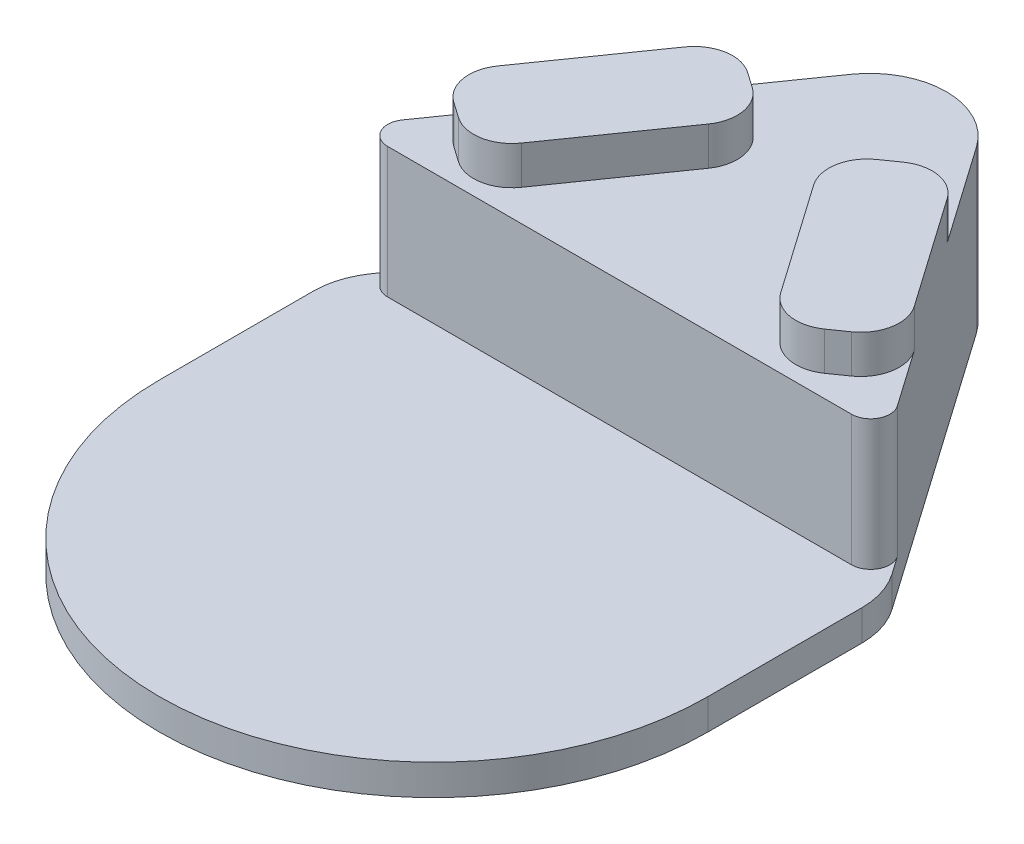
ISO-10303-21;
HEADER;
FILE_DESCRIPTION(('STEP AP214'),'2;1');
FILE_NAME('part.step','',(''),(''),'','','');
FILE_SCHEMA(('AUTOMOTIVE_DESIGN { 1 0 10303 214 1 1 1 1 }'));
ENDSEC;
DATA;
#1=APPLICATION_CONTEXT('core data for automotive mechanical design processes');
#2=APPLICATION_PROTOCOL_DEFINITION('international standard','automotive_design',2000,#1);
#3=PRODUCT_CONTEXT('',#1,'mechanical');
#4=PRODUCT('Part','Part','',(#3));
#5=PRODUCT_RELATED_PRODUCT_CATEGORY('part','',(#4));
#6=PRODUCT_DEFINITION_FORMATION('','',#4);
#7=PRODUCT_DEFINITION_CONTEXT('part definition',#1,'design');
#8=PRODUCT_DEFINITION('design','',#6,#7);
#9=PRODUCT_DEFINITION_SHAPE('','',#8);
#10=(LENGTH_UNIT() NAMED_UNIT(*) SI_UNIT(.MILLI.,.METRE.));
#11=(NAMED_UNIT(*) PLANE_ANGLE_UNIT() SI_UNIT($,.RADIAN.));
#12=(NAMED_UNIT(*) SI_UNIT($,.STERADIAN.) SOLID_ANGLE_UNIT());
#13=UNCERTAINTY_MEASURE_WITH_UNIT(LENGTH_MEASURE(1.E-05),#10,'distance_accuracy_value','');
#14=(GEOMETRIC_REPRESENTATION_CONTEXT(3) GLOBAL_UNCERTAINTY_ASSIGNED_CONTEXT((#13)) GLOBAL_UNIT_ASSIGNED_CONTEXT((#10,
#11,#12)) REPRESENTATION_CONTEXT('',''));
#15=CARTESIAN_POINT('',(0.,0.,0.));
#16=DIRECTION('',(0.,0.,1.));
#17=DIRECTION('',(1.,0.,0.));
#18=AXIS2_PLACEMENT_3D('',#15,#16,#17);
#19=CARTESIAN_POINT('',(0.,0.8,-15.5));
#20=DIRECTION('',(0.,-1.,0.));
#21=DIRECTION('',(0.,0.,-1.));
#22=AXIS2_PLACEMENT_3D('',#19,#20,#21);
#23=CYLINDRICAL_SURFACE('',#22,7.15);
#24=CARTESIAN_POINT('',(0.,0.,-15.5));
#25=DIRECTION('',(0.,1.,0.));
#26=DIRECTION('',(0.,0.,1.));
#27=AXIS2_PLACEMENT_3D('',#24,#25,#26);
#28=CIRCLE('',#27,7.15);
#29=CARTESIAN_POINT('',(-7.15,0.,-15.5));
#30=VERTEX_POINT('',#29);
#31=CARTESIAN_POINT('',(7.15,0.,-15.5));
#32=VERTEX_POINT('',#31);
#33=EDGE_CURVE('E266',#30,#32,#28,.T.);
#34=ORIENTED_EDGE('',*,*,#33,.T.);
#35=DIRECTION('',(0.,-1.,0.));
#36=VECTOR('',#35,1.);
#37=CARTESIAN_POINT('',(7.15,0.8,-15.5));
#38=LINE('',#37,#36);
#39=CARTESIAN_POINT('',(7.15,0.8,-15.5));
#40=VERTEX_POINT('',#39);
#41=EDGE_CURVE('E344',#40,#32,#38,.T.);
#42=ORIENTED_EDGE('',*,*,#41,.F.);
#43=CARTESIAN_POINT('',(0.,0.8,-15.5));
#44=DIRECTION('',(0.,1.,0.));
#45=DIRECTION('',(0.,0.,1.));
#46=AXIS2_PLACEMENT_3D('',#43,#44,#45);
#47=CIRCLE('',#46,7.15);
#48=CARTESIAN_POINT('',(-7.15,0.8,-15.5));
#49=VERTEX_POINT('',#48);
#50=EDGE_CURVE('E302',#49,#40,#47,.T.);
#51=ORIENTED_EDGE('',*,*,#50,.F.);
#52=DIRECTION('',(0.,-1.,0.));
#53=VECTOR('',#52,1.);
#54=CARTESIAN_POINT('',(-7.15,0.8,-15.5));
#55=LINE('',#54,#53);
#56=EDGE_CURVE('E317',#49,#30,#55,.T.);
#57=ORIENTED_EDGE('',*,*,#56,.T.);
#58=EDGE_LOOP('',(#34,#42,#51,#57));
#59=FACE_BOUND('',#58,.T.);
#60=ADVANCED_FACE('F45',(#59),#23,.T.);
#61=CARTESIAN_POINT('',(7.15,0.8,-19.5152155093377));
#62=DIRECTION('',(-1.,0.,0.));
#63=DIRECTION('',(0.,0.,1.));
#64=AXIS2_PLACEMENT_3D('',#61,#62,#63);
#65=PLANE('',#64);
#66=DIRECTION('',(0.,0.,-1.));
#67=VECTOR('',#66,1.);
#68=CARTESIAN_POINT('',(7.15,0.,-19.5152155093377));
#69=LINE('',#68,#67);
#70=CARTESIAN_POINT('',(7.15,0.,-19.5152155093377));
#71=VERTEX_POINT('',#70);
#72=EDGE_CURVE('E270',#32,#71,#69,.T.);
#73=ORIENTED_EDGE('',*,*,#72,.T.);
#74=DIRECTION('',(0.,-1.,0.));
#75=VECTOR('',#74,1.);
#76=CARTESIAN_POINT('',(7.15,0.8,-19.5152155093377));
#77=LINE('',#76,#75);
#78=CARTESIAN_POINT('',(7.15,0.8,-19.5152155093377));
#79=VERTEX_POINT('',#78);
#80=EDGE_CURVE('E341',#79,#71,#77,.T.);
#81=ORIENTED_EDGE('',*,*,#80,.F.);
#82=DIRECTION('',(0.,0.,-1.));
#83=VECTOR('',#82,1.);
#84=CARTESIAN_POINT('',(7.15,0.8,-19.5152155093377));
#85=LINE('',#84,#83);
#86=EDGE_CURVE('E305',#40,#79,#85,.T.);
#87=ORIENTED_EDGE('',*,*,#86,.F.);
#88=ORIENTED_EDGE('',*,*,#41,.T.);
#89=EDGE_LOOP('',(#73,#81,#87,#88));
#90=FACE_BOUND('',#89,.T.);
#91=ADVANCED_FACE('F485',(#90),#65,.F.);
#92=CARTESIAN_POINT('',(5.15,0.8,-19.5152155093377));
#93=DIRECTION('',(0.,-1.,0.));
#94=DIRECTION('',(0.,0.,-1.));
#95=AXIS2_PLACEMENT_3D('',#92,#93,#94);
#96=CYLINDRICAL_SURFACE('',#95,2.);
#97=CARTESIAN_POINT('',(5.15,0.,-19.5152155093377));
#98=DIRECTION('',(0.,1.,0.));
#99=DIRECTION('',(0.,0.,-1.));
#100=AXIS2_PLACEMENT_3D('',#97,#98,#99);
#101=CIRCLE('',#100,2.);
#102=CARTESIAN_POINT('',(6.78830408857798,0.,-20.6623683820398));
#103=VERTEX_POINT('',#102);
#104=EDGE_CURVE('E320',#71,#103,#101,.T.);
#105=ORIENTED_EDGE('',*,*,#104,.T.);
#106=DIRECTION('',(0.,-1.,0.));
#107=VECTOR('',#106,1.);
#108=CARTESIAN_POINT('',(6.78830408857798,0.8,-20.6623683820398));
#109=LINE('',#108,#107);
#110=CARTESIAN_POINT('',(6.78830408857798,0.8,-20.6623683820398));
#111=VERTEX_POINT('',#110);
#112=EDGE_CURVE('E338',#111,#103,#109,.T.);
#113=ORIENTED_EDGE('',*,*,#112,.F.);
#114=CARTESIAN_POINT('',(5.15,0.8,-19.5152155093377));
#115=DIRECTION('',(0.,1.,0.));
#116=DIRECTION('',(0.,0.,-1.));
#117=AXIS2_PLACEMENT_3D('',#114,#115,#116);
#118=CIRCLE('',#117,2.);
#119=EDGE_CURVE('E308',#79,#111,#118,.T.);
#120=ORIENTED_EDGE('',*,*,#119,.F.);
#121=ORIENTED_EDGE('',*,*,#80,.T.);
#122=EDGE_LOOP('',(#105,#113,#120,#121));
#123=FACE_BOUND('',#122,.T.);
#124=ADVANCED_FACE('F488',(#123),#96,.T.);
#125=CARTESIAN_POINT('',(1.63830408857799,0.8,-28.0173306167617));
#126=DIRECTION('',(-0.819152044288993,0.,0.573576436351044));
#127=DIRECTION('',(0.573576436351044,0.,0.819152044288993));
#128=AXIS2_PLACEMENT_3D('',#125,#126,#127);
#129=PLANE('',#128);
#130=DIRECTION('',(-0.573576436351045,0.,-0.819152044288993));
#131=VECTOR('',#130,1.);
#132=CARTESIAN_POINT('',(6.4556918304933,4.2,-21.1373879154414));
#133=LINE('',#132,#131);
#134=CARTESIAN_POINT('',(3.42145654707353,4.2,-25.470724987444));
#135=VERTEX_POINT('',#134);
#136=CARTESIAN_POINT('',(1.63830408857798,4.2,-28.0173306167617));
#137=VERTEX_POINT('',#136);
#138=EDGE_CURVE('E264',#135,#137,#133,.T.);
#139=ORIENTED_EDGE('',*,*,#138,.F.);
#140=DIRECTION('',(0.,-1.,0.));
#141=VECTOR('',#140,1.);
#142=CARTESIAN_POINT('',(3.42145654707353,0.8,-25.470724987444));
#143=LINE('',#142,#141);
#144=CARTESIAN_POINT('',(3.42145654707353,5.2,-25.470724987444));
#145=VERTEX_POINT('',#144);
#146=EDGE_CURVE('E392',#135,#145,#143,.F.);
#147=ORIENTED_EDGE('',*,*,#146,.T.);
#148=DIRECTION('',(-0.573576436351044,0.,-0.819152044288993));
#149=VECTOR('',#148,1.);
#150=CARTESIAN_POINT('',(2.84788011072248,5.2,-26.289877031733));
#151=LINE('',#150,#149);
#152=CARTESIAN_POINT('',(5.42897407430218,5.2,-22.6036928324325));
#153=VERTEX_POINT('',#152);
#154=EDGE_CURVE('E432',#153,#145,#151,.T.);
#155=ORIENTED_EDGE('',*,*,#154,.F.);
#156=DIRECTION('',(0.,-1.,0.));
#157=VECTOR('',#156,1.);
#158=CARTESIAN_POINT('',(5.42897407430218,0.8,-22.6036928324325));
#159=LINE('',#158,#157);
#160=CARTESIAN_POINT('',(5.42897407430218,4.2,-22.6036928324325));
#161=VERTEX_POINT('',#160);
#162=EDGE_CURVE('E389',#153,#161,#159,.T.);
#163=ORIENTED_EDGE('',*,*,#162,.T.);
#164=CARTESIAN_POINT('',(6.4556918304933,4.2,-21.1373879154414));
#165=VERTEX_POINT('',#164);
#166=EDGE_CURVE('E267',#165,#161,#133,.T.);
#167=ORIENTED_EDGE('',*,*,#166,.F.);
#168=DIRECTION('',(0.,-1.,0.));
#169=VECTOR('',#168,1.);
#170=CARTESIAN_POINT('',(6.4556918304933,24.0201708953733,-21.1373879154414));
#171=LINE('',#170,#169);
#172=CARTESIAN_POINT('',(6.4556918304933,0.8,-21.1373879154414));
#173=VERTEX_POINT('',#172);
#174=EDGE_CURVE('E295',#165,#173,#171,.T.);
#175=ORIENTED_EDGE('',*,*,#174,.T.);
#176=DIRECTION('',(-0.573576436351044,0.,-0.819152044288993));
#177=VECTOR('',#176,1.);
#178=CARTESIAN_POINT('',(1.63830408857799,0.8,-28.0173306167617));
#179=LINE('',#178,#177);
#180=EDGE_CURVE('E310',#111,#173,#179,.T.);
#181=ORIENTED_EDGE('',*,*,#180,.F.);
#182=ORIENTED_EDGE('',*,*,#112,.T.);
#183=DIRECTION('',(-0.573576436351044,0.,-0.819152044288993));
#184=VECTOR('',#183,1.);
#185=CARTESIAN_POINT('',(1.63830408857799,0.,-28.0173306167617));
#186=LINE('',#185,#184);
#187=CARTESIAN_POINT('',(1.63830408857798,0.,-28.0173306167617));
#188=VERTEX_POINT('',#187);
#189=EDGE_CURVE('E322',#103,#188,#186,.T.);
#190=ORIENTED_EDGE('',*,*,#189,.T.);
#191=DIRECTION('',(0.,-1.,0.));
#192=VECTOR('',#191,1.);
#193=CARTESIAN_POINT('',(1.63830408857798,0.8,-28.0173306167617));
#194=LINE('',#193,#192);
#195=EDGE_CURVE('E247',#137,#188,#194,.T.);
#196=ORIENTED_EDGE('',*,*,#195,.F.);
#197=EDGE_LOOP('',(#139,#147,#155,#163,#167,#175,#181,#182,#190,#196));
#198=FACE_BOUND('',#197,.T.);
#199=ADVANCED_FACE('F491',(#198),#129,.F.);
#200=CARTESIAN_POINT('',(0.,0.8,-26.8701777440596));
#201=DIRECTION('',(0.,-1.,0.));
#202=DIRECTION('',(0.,0.,-1.));
#203=AXIS2_PLACEMENT_3D('',#200,#201,#202);
#204=CYLINDRICAL_SURFACE('',#203,2.);
#205=CARTESIAN_POINT('',(0.,0.,-26.8701777440596));
#206=DIRECTION('',(0.,1.,0.));
#207=DIRECTION('',(0.,0.,-1.));
#208=AXIS2_PLACEMENT_3D('',#205,#206,#207);
#209=CIRCLE('',#208,2.);
#210=CARTESIAN_POINT('',(-1.63830408857799,0.,-28.0173306167617));
#211=VERTEX_POINT('',#210);
#212=EDGE_CURVE('E244',#188,#211,#209,.T.);
#213=ORIENTED_EDGE('',*,*,#212,.T.);
#214=DIRECTION('',(0.,-1.,0.));
#215=VECTOR('',#214,1.);
#216=CARTESIAN_POINT('',(-1.63830408857799,0.8,-28.0173306167617));
#217=LINE('',#216,#215);
#218=CARTESIAN_POINT('',(-1.63830408857799,4.2,-28.0173306167617));
#219=VERTEX_POINT('',#218);
#220=EDGE_CURVE('E237',#219,#211,#217,.T.);
#221=ORIENTED_EDGE('',*,*,#220,.F.);
#222=CARTESIAN_POINT('',(0.,4.2,-26.8701777440596));
#223=DIRECTION('',(0.,1.,0.));
#224=DIRECTION('',(0.,0.,1.));
#225=AXIS2_PLACEMENT_3D('',#222,#223,#224);
#226=CIRCLE('',#225,2.);
#227=EDGE_CURVE('E242',#137,#219,#226,.T.);
#228=ORIENTED_EDGE('',*,*,#227,.F.);
#229=ORIENTED_EDGE('',*,*,#195,.T.);
#230=EDGE_LOOP('',(#213,#221,#228,#229));
#231=FACE_BOUND('',#230,.T.);
#232=ADVANCED_FACE('F239',(#231),#204,.T.);
#233=CARTESIAN_POINT('',(-6.78830408857799,0.8,-20.6623683820398));
#234=DIRECTION('',(0.819152044288993,0.,0.573576436351044));
#235=DIRECTION('',(0.573576436351044,0.,-0.819152044288993));
#236=AXIS2_PLACEMENT_3D('',#233,#234,#235);
#237=PLANE('',#236);
#238=DIRECTION('',(-0.573576436351044,0.,0.819152044288993));
#239=VECTOR('',#238,1.);
#240=CARTESIAN_POINT('',(-2.84788011072248,5.2,-26.289877031733));
#241=LINE('',#240,#239);
#242=CARTESIAN_POINT('',(-3.42145654707353,5.2,-25.470724987444));
#243=VERTEX_POINT('',#242);
#244=CARTESIAN_POINT('',(-5.42897407430218,5.2,-22.6036928324325));
#245=VERTEX_POINT('',#244);
#246=EDGE_CURVE('E437',#243,#245,#241,.T.);
#247=ORIENTED_EDGE('',*,*,#246,.F.);
#248=DIRECTION('',(0.,-1.,0.));
#249=VECTOR('',#248,1.);
#250=CARTESIAN_POINT('',(-3.42145654707353,0.8,-25.470724987444));
#251=LINE('',#250,#249);
#252=CARTESIAN_POINT('',(-3.42145654707353,4.2,-25.470724987444));
#253=VERTEX_POINT('',#252);
#254=EDGE_CURVE('E255',#243,#253,#251,.T.);
#255=ORIENTED_EDGE('',*,*,#254,.T.);
#256=DIRECTION('',(-0.573576436351044,0.,0.819152044288993));
#257=VECTOR('',#256,1.);
#258=CARTESIAN_POINT('',(-1.63830408857799,4.2,-28.0173306167617));
#259=LINE('',#258,#257);
#260=EDGE_CURVE('E251',#219,#253,#259,.T.);
#261=ORIENTED_EDGE('',*,*,#260,.F.);
#262=ORIENTED_EDGE('',*,*,#220,.T.);
#263=DIRECTION('',(-0.573576436351044,0.,0.819152044288993));
#264=VECTOR('',#263,1.);
#265=CARTESIAN_POINT('',(-6.78830408857799,0.,-20.6623683820398));
#266=LINE('',#265,#264);
#267=CARTESIAN_POINT('',(-6.78830408857799,0.,-20.6623683820398));
#268=VERTEX_POINT('',#267);
#269=EDGE_CURVE('E325',#211,#268,#266,.T.);
#270=ORIENTED_EDGE('',*,*,#269,.T.);
#271=DIRECTION('',(0.,-1.,0.));
#272=VECTOR('',#271,1.);
#273=CARTESIAN_POINT('',(-6.78830408857799,0.8,-20.6623683820398));
#274=LINE('',#273,#272);
#275=CARTESIAN_POINT('',(-6.78830408857799,0.8,-20.6623683820398));
#276=VERTEX_POINT('',#275);
#277=EDGE_CURVE('E248',#276,#268,#274,.T.);
#278=ORIENTED_EDGE('',*,*,#277,.F.);
#279=DIRECTION('',(-0.573576436351044,0.,0.819152044288993));
#280=VECTOR('',#279,1.);
#281=CARTESIAN_POINT('',(-6.78830408857799,0.8,-20.6623683820398));
#282=LINE('',#281,#280);
#283=CARTESIAN_POINT('',(-6.4556918304933,0.8,-21.1373879154414));
#284=VERTEX_POINT('',#283);
#285=EDGE_CURVE('E312',#284,#276,#282,.T.);
#286=ORIENTED_EDGE('',*,*,#285,.F.);
#287=DIRECTION('',(0.,-1.,0.));
#288=VECTOR('',#287,1.);
#289=CARTESIAN_POINT('',(-6.4556918304933,24.0201708953733,-21.1373879154414));
#290=LINE('',#289,#288);
#291=CARTESIAN_POINT('',(-6.4556918304933,4.2,-21.1373879154414));
#292=VERTEX_POINT('',#291);
#293=EDGE_CURVE('E298',#292,#284,#290,.T.);
#294=ORIENTED_EDGE('',*,*,#293,.F.);
#295=CARTESIAN_POINT('',(-5.42897407430218,4.2,-22.6036928324325));
#296=VERTEX_POINT('',#295);
#297=EDGE_CURVE('E259',#296,#292,#259,.T.);
#298=ORIENTED_EDGE('',*,*,#297,.F.);
#299=DIRECTION('',(0.,-1.,0.));
#300=VECTOR('',#299,1.);
#301=CARTESIAN_POINT('',(-5.42897407430218,0.8,-22.6036928324325));
#302=LINE('',#301,#300);
#303=EDGE_CURVE('E347',#296,#245,#302,.F.);
#304=ORIENTED_EDGE('',*,*,#303,.T.);
#305=EDGE_LOOP('',(#247,#255,#261,#262,#270,#278,#286,#294,#298,#304));
#306=FACE_BOUND('',#305,.T.);
#307=ADVANCED_FACE('F253',(#306),#237,.F.);
#308=CARTESIAN_POINT('',(-5.15,0.8,-19.5152155093377));
#309=DIRECTION('',(0.,-1.,0.));
#310=DIRECTION('',(0.,0.,-1.));
#311=AXIS2_PLACEMENT_3D('',#308,#309,#310);
#312=CYLINDRICAL_SURFACE('',#311,2.);
#313=CARTESIAN_POINT('',(-5.15,0.,-19.5152155093377));
#314=DIRECTION('',(0.,1.,0.));
#315=DIRECTION('',(0.,0.,1.));
#316=AXIS2_PLACEMENT_3D('',#313,#314,#315);
#317=CIRCLE('',#316,2.);
#318=CARTESIAN_POINT('',(-7.15,0.,-19.5152155093377));
#319=VERTEX_POINT('',#318);
#320=EDGE_CURVE('E327',#268,#319,#317,.T.);
#321=ORIENTED_EDGE('',*,*,#320,.T.);
#322=DIRECTION('',(0.,-1.,0.));
#323=VECTOR('',#322,1.);
#324=CARTESIAN_POINT('',(-7.15,0.8,-19.5152155093377));
#325=LINE('',#324,#323);
#326=CARTESIAN_POINT('',(-7.15,0.8,-19.5152155093377));
#327=VERTEX_POINT('',#326);
#328=EDGE_CURVE('E332',#327,#319,#325,.T.);
#329=ORIENTED_EDGE('',*,*,#328,.F.);
#330=CARTESIAN_POINT('',(-5.15,0.8,-19.5152155093377));
#331=DIRECTION('',(0.,1.,0.));
#332=DIRECTION('',(0.,0.,1.));
#333=AXIS2_PLACEMENT_3D('',#330,#331,#332);
#334=CIRCLE('',#333,2.);
#335=EDGE_CURVE('E314',#276,#327,#334,.T.);
#336=ORIENTED_EDGE('',*,*,#335,.F.);
#337=ORIENTED_EDGE('',*,*,#277,.T.);
#338=EDGE_LOOP('',(#321,#329,#336,#337));
#339=FACE_BOUND('',#338,.T.);
#340=ADVANCED_FACE('F472',(#339),#312,.T.);
#341=CARTESIAN_POINT('',(-7.15,0.8,-19.5152155093377));
#342=DIRECTION('',(1.,0.,0.));
#343=DIRECTION('',(0.,0.,-1.));
#344=AXIS2_PLACEMENT_3D('',#341,#342,#343);
#345=PLANE('',#344);
#346=DIRECTION('',(0.,0.,1.));
#347=VECTOR('',#346,1.);
#348=CARTESIAN_POINT('',(-7.15,0.,-19.5152155093377));
#349=LINE('',#348,#347);
#350=EDGE_CURVE('E306',#319,#30,#349,.T.);
#351=ORIENTED_EDGE('',*,*,#350,.T.);
#352=ORIENTED_EDGE('',*,*,#56,.F.);
#353=DIRECTION('',(0.,0.,1.));
#354=VECTOR('',#353,1.);
#355=CARTESIAN_POINT('',(-7.15,0.8,-19.5152155093377));
#356=LINE('',#355,#354);
#357=EDGE_CURVE('E316',#327,#49,#356,.T.);
#358=ORIENTED_EDGE('',*,*,#357,.F.);
#359=ORIENTED_EDGE('',*,*,#328,.T.);
#360=EDGE_LOOP('',(#351,#352,#358,#359));
#361=FACE_BOUND('',#360,.T.);
#362=ADVANCED_FACE('F476',(#361),#345,.F.);
#363=CARTESIAN_POINT('',(0.,0.8,-15.5));
#364=DIRECTION('',(0.,1.,0.));
#365=DIRECTION('',(0.,0.,1.));
#366=AXIS2_PLACEMENT_3D('',#363,#364,#365);
#367=PLANE('',#366);
#368=CARTESIAN_POINT('',(-6.0461158083488,0.8,-20.8505996972659));
#369=DIRECTION('',(0.,1.,0.));
#370=DIRECTION('',(0.,0.,1.));
#371=AXIS2_PLACEMENT_3D('',#368,#369,#370);
#372=CIRCLE('',#371,0.500000000000001);
#373=CARTESIAN_POINT('',(-6.0461158083488,0.8,-20.3505996972659));
#374=VERTEX_POINT('',#373);
#375=EDGE_CURVE('E274',#284,#374,#372,.T.);
#376=ORIENTED_EDGE('',*,*,#375,.F.);
#377=ORIENTED_EDGE('',*,*,#285,.T.);
#378=ORIENTED_EDGE('',*,*,#335,.T.);
#379=ORIENTED_EDGE('',*,*,#357,.T.);
#380=ORIENTED_EDGE('',*,*,#50,.T.);
#381=ORIENTED_EDGE('',*,*,#86,.T.);
#382=ORIENTED_EDGE('',*,*,#119,.T.);
#383=ORIENTED_EDGE('',*,*,#180,.T.);
#384=CARTESIAN_POINT('',(6.0461158083488,0.8,-20.8505996972659));
#385=DIRECTION('',(0.,1.,0.));
#386=DIRECTION('',(0.,0.,1.));
#387=AXIS2_PLACEMENT_3D('',#384,#385,#386);
#388=CIRCLE('',#387,0.5);
#389=CARTESIAN_POINT('',(6.0461158083488,0.8,-20.3505996972659));
#390=VERTEX_POINT('',#389);
#391=EDGE_CURVE('E294',#390,#173,#388,.T.);
#392=ORIENTED_EDGE('',*,*,#391,.F.);
#393=DIRECTION('',(1.,0.,0.));
#394=VECTOR('',#393,1.);
#395=CARTESIAN_POINT('',(-6.0461158083488,0.8,-20.3505996972659));
#396=LINE('',#395,#394);
#397=EDGE_CURVE('E290',#374,#390,#396,.T.);
#398=ORIENTED_EDGE('',*,*,#397,.F.);
#399=EDGE_LOOP('',(#376,#377,#378,#379,#380,#381,#382,#383,#392,#398));
#400=FACE_BOUND('',#399,.T.);
#401=ADVANCED_FACE('F454',(#400),#367,.T.);
#402=CARTESIAN_POINT('',(0.,0.,-15.5));
#403=DIRECTION('',(0.,1.,0.));
#404=DIRECTION('',(0.,0.,1.));
#405=AXIS2_PLACEMENT_3D('',#402,#403,#404);
#406=PLANE('',#405);
#407=ORIENTED_EDGE('',*,*,#33,.F.);
#408=ORIENTED_EDGE('',*,*,#350,.F.);
#409=ORIENTED_EDGE('',*,*,#320,.F.);
#410=ORIENTED_EDGE('',*,*,#269,.F.);
#411=ORIENTED_EDGE('',*,*,#212,.F.);
#412=ORIENTED_EDGE('',*,*,#189,.F.);
#413=ORIENTED_EDGE('',*,*,#104,.F.);
#414=ORIENTED_EDGE('',*,*,#72,.F.);
#415=EDGE_LOOP('',(#407,#408,#409,#410,#411,#412,#413,#414));
#416=FACE_BOUND('',#415,.T.);
#417=ADVANCED_FACE('F544',(#416),#406,.F.);
#418=CARTESIAN_POINT('',(-6.0461158083488,24.0201708953733,-20.8505996972659));
#419=DIRECTION('',(0.,-1.,0.));
#420=DIRECTION('',(0.,0.,-1.));
#421=AXIS2_PLACEMENT_3D('',#418,#419,#420);
#422=CYLINDRICAL_SURFACE('',#421,0.500000000000001);
#423=CARTESIAN_POINT('',(-6.0461158083488,4.2,-20.8505996972659));
#424=DIRECTION('',(0.,1.,0.));
#425=DIRECTION('',(0.,0.,1.));
#426=AXIS2_PLACEMENT_3D('',#423,#424,#425);
#427=CIRCLE('',#426,0.500000000000001);
#428=CARTESIAN_POINT('',(-6.0461158083488,4.2,-20.3505996972659));
#429=VERTEX_POINT('',#428);
#430=EDGE_CURVE('E258',#292,#429,#427,.T.);
#431=ORIENTED_EDGE('',*,*,#430,.F.);
#432=ORIENTED_EDGE('',*,*,#293,.T.);
#433=ORIENTED_EDGE('',*,*,#375,.T.);
#434=DIRECTION('',(0.,-1.,0.));
#435=VECTOR('',#434,1.);
#436=CARTESIAN_POINT('',(-6.0461158083488,24.0201708953733,-20.3505996972659));
#437=LINE('',#436,#435);
#438=EDGE_CURVE('E287',#429,#374,#437,.T.);
#439=ORIENTED_EDGE('',*,*,#438,.F.);
#440=EDGE_LOOP('',(#431,#432,#433,#439));
#441=FACE_BOUND('',#440,.T.);
#442=ADVANCED_FACE('F465',(#441),#422,.T.);
#443=CARTESIAN_POINT('',(-6.0461158083488,24.0201708953733,-20.3505996972659));
#444=DIRECTION('',(0.,0.,-1.));
#445=DIRECTION('',(-1.,0.,0.));
#446=AXIS2_PLACEMENT_3D('',#443,#444,#445);
#447=PLANE('',#446);
#448=DIRECTION('',(1.,0.,0.));
#449=VECTOR('',#448,1.);
#450=CARTESIAN_POINT('',(-6.0461158083488,4.2,-20.3505996972659));
#451=LINE('',#450,#449);
#452=CARTESIAN_POINT('',(-3.95467039993074,4.2,-20.3505996972659));
#453=VERTEX_POINT('',#452);
#454=EDGE_CURVE('E280',#429,#453,#451,.T.);
#455=ORIENTED_EDGE('',*,*,#454,.F.);
#456=ORIENTED_EDGE('',*,*,#438,.T.);
#457=ORIENTED_EDGE('',*,*,#397,.T.);
#458=DIRECTION('',(0.,-1.,0.));
#459=VECTOR('',#458,1.);
#460=CARTESIAN_POINT('',(6.0461158083488,24.0201708953733,-20.3505996972659));
#461=LINE('',#460,#459);
#462=CARTESIAN_POINT('',(6.0461158083488,4.2,-20.3505996972659));
#463=VERTEX_POINT('',#462);
#464=EDGE_CURVE('E291',#463,#390,#461,.T.);
#465=ORIENTED_EDGE('',*,*,#464,.F.);
#466=CARTESIAN_POINT('',(3.95467039993073,4.2,-20.3505996972659));
#467=VERTEX_POINT('',#466);
#468=EDGE_CURVE('E284',#467,#463,#451,.T.);
#469=ORIENTED_EDGE('',*,*,#468,.F.);
#470=EDGE_CURVE('E283',#453,#467,#451,.T.);
#471=ORIENTED_EDGE('',*,*,#470,.F.);
#472=EDGE_LOOP('',(#455,#456,#457,#465,#469,#471));
#473=FACE_BOUND('',#472,.T.);
#474=ADVANCED_FACE('F449',(#473),#447,.F.);
#475=CARTESIAN_POINT('',(6.0461158083488,24.0201708953733,-20.8505996972659));
#476=DIRECTION('',(0.,-1.,0.));
#477=DIRECTION('',(0.,0.,-1.));
#478=AXIS2_PLACEMENT_3D('',#475,#476,#477);
#479=CYLINDRICAL_SURFACE('',#478,0.5);
#480=CARTESIAN_POINT('',(6.0461158083488,4.2,-20.8505996972659));
#481=DIRECTION('',(0.,1.,0.));
#482=DIRECTION('',(0.,0.,1.));
#483=AXIS2_PLACEMENT_3D('',#480,#481,#482);
#484=CIRCLE('',#483,0.5);
#485=EDGE_CURVE('E277',#463,#165,#484,.T.);
#486=ORIENTED_EDGE('',*,*,#485,.F.);
#487=ORIENTED_EDGE('',*,*,#464,.T.);
#488=ORIENTED_EDGE('',*,*,#391,.T.);
#489=ORIENTED_EDGE('',*,*,#174,.F.);
#490=EDGE_LOOP('',(#486,#487,#488,#489));
#491=FACE_BOUND('',#490,.T.);
#492=ADVANCED_FACE('F460',(#491),#479,.T.);
#493=CARTESIAN_POINT('',(0.,4.2,-15.5));
#494=DIRECTION('',(0.,1.,0.));
#495=DIRECTION('',(0.,0.,1.));
#496=AXIS2_PLACEMENT_3D('',#493,#494,#495);
#497=PLANE('',#496);
#498=DIRECTION('',(0.819152044288994,0.,-0.573576436351043));
#499=VECTOR('',#498,1.);
#500=CARTESIAN_POINT('',(3.95467039993074,4.2,-20.3505996972659));
#501=LINE('',#500,#499);
#502=CARTESIAN_POINT('',(4.77382244421973,4.2,-20.924176133617));
#503=VERTEX_POINT('',#502);
#504=CARTESIAN_POINT('',(5.18339846636423,4.2,-21.2109643517925));
#505=VERTEX_POINT('',#504);
#506=EDGE_CURVE('E413',#503,#505,#501,.T.);
#507=ORIENTED_EDGE('',*,*,#506,.F.);
#508=CARTESIAN_POINT('',(4.20024600786869,4.2,-21.743328177906));
#509=DIRECTION('',(0.,1.,0.));
#510=DIRECTION('',(0.,0.,1.));
#511=AXIS2_PLACEMENT_3D('',#508,#509,#510);
#512=CIRCLE('',#511,1.);
#513=CARTESIAN_POINT('',(3.3810939635797,4.2,-21.1697517415549));
#514=VERTEX_POINT('',#513);
#515=EDGE_CURVE('E53',#503,#514,#512,.F.);
#516=ORIENTED_EDGE('',*,*,#515,.T.);
#517=DIRECTION('',(0.573576436351043,0.,0.819152044288994));
#518=VECTOR('',#517,1.);
#519=CARTESIAN_POINT('',(0.800000000000007,4.2,-24.8559359408554));
#520=LINE('',#519,#518);
#521=CARTESIAN_POINT('',(1.37357643635105,4.2,-24.0367838965664));
#522=VERTEX_POINT('',#521);
#523=EDGE_CURVE('E60',#522,#514,#520,.T.);
#524=ORIENTED_EDGE('',*,*,#523,.F.);
#525=CARTESIAN_POINT('',(2.19272848064004,4.2,-24.6103603329174));
#526=DIRECTION('',(0.,1.,0.));
#527=DIRECTION('',(0.,0.,1.));
#528=AXIS2_PLACEMENT_3D('',#525,#526,#527);
#529=CIRCLE('',#528,1.);
#530=CARTESIAN_POINT('',(1.61915204428899,4.2,-25.4295123772064));
#531=VERTEX_POINT('',#530);
#532=EDGE_CURVE('E401',#522,#531,#529,.F.);
#533=ORIENTED_EDGE('',*,*,#532,.T.);
#534=DIRECTION('',(-0.81915204428899,0.,0.573576436351048));
#535=VECTOR('',#534,1.);
#536=CARTESIAN_POINT('',(2.84788011072248,4.2,-26.289877031733));
#537=LINE('',#536,#535);
#538=CARTESIAN_POINT('',(2.02872806643349,4.2,-25.7163005953819));
#539=VERTEX_POINT('',#538);
#540=EDGE_CURVE('E430',#539,#531,#537,.T.);
#541=ORIENTED_EDGE('',*,*,#540,.F.);
#542=CARTESIAN_POINT('',(2.60230450278453,4.2,-24.897148551093));
#543=DIRECTION('',(0.,1.,0.));
#544=DIRECTION('',(0.,0.,1.));
#545=AXIS2_PLACEMENT_3D('',#542,#543,#544);
#546=CIRCLE('',#545,1.);
#547=EDGE_CURVE('E410',#539,#135,#546,.F.);
#548=ORIENTED_EDGE('',*,*,#547,.T.);
#549=ORIENTED_EDGE('',*,*,#138,.T.);
#550=ORIENTED_EDGE('',*,*,#227,.T.);
#551=ORIENTED_EDGE('',*,*,#260,.T.);
#552=CARTESIAN_POINT('',(-2.60230450278453,4.2,-24.897148551093));
#553=DIRECTION('',(0.,1.,0.));
#554=DIRECTION('',(0.,0.,1.));
#555=AXIS2_PLACEMENT_3D('',#552,#553,#554);
#556=CIRCLE('',#555,1.);
#557=CARTESIAN_POINT('',(-2.02872806643349,4.2,-25.7163005953819));
#558=VERTEX_POINT('',#557);
#559=EDGE_CURVE('E399',#253,#558,#556,.F.);
#560=ORIENTED_EDGE('',*,*,#559,.T.);
#561=DIRECTION('',(-0.819152044288993,0.,-0.573576436351044));
#562=VECTOR('',#561,1.);
#563=CARTESIAN_POINT('',(-0.799999999999999,4.2,-24.8559359408554));
#564=LINE('',#563,#562);
#565=CARTESIAN_POINT('',(-1.61915204428899,4.2,-25.4295123772064));
#566=VERTEX_POINT('',#565);
#567=EDGE_CURVE('E594',#566,#558,#564,.T.);
#568=ORIENTED_EDGE('',*,*,#567,.F.);
#569=CARTESIAN_POINT('',(-2.19272848064004,4.2,-24.6103603329174));
#570=DIRECTION('',(0.,1.,0.));
#571=DIRECTION('',(0.,0.,1.));
#572=AXIS2_PLACEMENT_3D('',#569,#570,#571);
#573=CIRCLE('',#572,1.);
#574=CARTESIAN_POINT('',(-1.37357643635104,4.2,-24.0367838965664));
#575=VERTEX_POINT('',#574);
#576=EDGE_CURVE('E408',#566,#575,#573,.F.);
#577=ORIENTED_EDGE('',*,*,#576,.T.);
#578=DIRECTION('',(0.573576436351044,0.,-0.819152044288993));
#579=VECTOR('',#578,1.);
#580=CARTESIAN_POINT('',(-3.95467039993074,4.2,-20.3505996972659));
#581=LINE('',#580,#579);
#582=CARTESIAN_POINT('',(-3.3810939635797,4.2,-21.1697517415549));
#583=VERTEX_POINT('',#582);
#584=EDGE_CURVE('E591',#583,#575,#581,.T.);
#585=ORIENTED_EDGE('',*,*,#584,.F.);
#586=CARTESIAN_POINT('',(-4.20024600786869,4.2,-21.743328177906));
#587=DIRECTION('',(0.,1.,0.));
#588=DIRECTION('',(0.,0.,1.));
#589=AXIS2_PLACEMENT_3D('',#586,#587,#588);
#590=CIRCLE('',#589,1.);
#591=CARTESIAN_POINT('',(-4.77382244421974,4.2,-20.924176133617));
#592=VERTEX_POINT('',#591);
#593=EDGE_CURVE('E406',#583,#592,#590,.F.);
#594=ORIENTED_EDGE('',*,*,#593,.T.);
#595=DIRECTION('',(0.819152044288993,0.,0.573576436351045));
#596=VECTOR('',#595,1.);
#597=CARTESIAN_POINT('',(-6.00255051065322,4.2,-21.7845407881435));
#598=LINE('',#597,#596);
#599=CARTESIAN_POINT('',(-5.18339846636423,4.2,-21.2109643517925));
#600=VERTEX_POINT('',#599);
#601=EDGE_CURVE('E68',#600,#592,#598,.T.);
#602=ORIENTED_EDGE('',*,*,#601,.F.);
#603=CARTESIAN_POINT('',(-4.60982203001319,4.2,-22.0301163960815));
#604=DIRECTION('',(0.,1.,0.));
#605=DIRECTION('',(0.,0.,1.));
#606=AXIS2_PLACEMENT_3D('',#603,#604,#605);
#607=CIRCLE('',#606,1.);
#608=EDGE_CURVE('E403',#600,#296,#607,.F.);
#609=ORIENTED_EDGE('',*,*,#608,.T.);
#610=ORIENTED_EDGE('',*,*,#297,.T.);
#611=ORIENTED_EDGE('',*,*,#430,.T.);
#612=ORIENTED_EDGE('',*,*,#454,.T.);
#613=ORIENTED_EDGE('',*,*,#470,.T.);
#614=ORIENTED_EDGE('',*,*,#468,.T.);
#615=ORIENTED_EDGE('',*,*,#485,.T.);
#616=ORIENTED_EDGE('',*,*,#166,.T.);
#617=CARTESIAN_POINT('',(4.60982203001319,4.2,-22.0301163960815));
#618=DIRECTION('',(0.,1.,0.));
#619=DIRECTION('',(0.,0.,1.));
#620=AXIS2_PLACEMENT_3D('',#617,#618,#619);
#621=CIRCLE('',#620,1.);
#622=EDGE_CURVE('E12',#161,#505,#621,.F.);
#623=ORIENTED_EDGE('',*,*,#622,.T.);
#624=EDGE_LOOP('',(#507,#516,#524,#533,#541,#548,#549,#550,#551,#560,#568,#577,#585,#594,#602,
#609,#610,#611,#612,#613,#614,#615,#616,#623));
#625=FACE_BOUND('',#624,.T.);
#626=ADVANCED_FACE('F262',(#625),#497,.T.);
#627=CARTESIAN_POINT('',(0.800000000000007,5.2,-24.8559359408554));
#628=DIRECTION('',(0.819152044288994,0.,-0.573576436351043));
#629=DIRECTION('',(-0.573576436351043,0.,-0.819152044288994));
#630=AXIS2_PLACEMENT_3D('',#627,#628,#629);
#631=PLANE('',#630);
#632=DIRECTION('',(0.573576436351043,0.,0.819152044288994));
#633=VECTOR('',#632,1.);
#634=CARTESIAN_POINT('',(0.800000000000007,5.2,-24.8559359408554));
#635=LINE('',#634,#633);
#636=CARTESIAN_POINT('',(1.37357643635105,5.2,-24.0367838965664));
#637=VERTEX_POINT('',#636);
#638=CARTESIAN_POINT('',(3.3810939635797,5.2,-21.1697517415549));
#639=VERTEX_POINT('',#638);
#640=EDGE_CURVE('E421',#637,#639,#635,.T.);
#641=ORIENTED_EDGE('',*,*,#640,.F.);
#642=DIRECTION('',(0.,-1.,0.));
#643=VECTOR('',#642,1.);
#644=CARTESIAN_POINT('',(1.37357643635105,5.2,-24.0367838965664));
#645=LINE('',#644,#643);
#646=EDGE_CURVE('E365',#637,#522,#645,.T.);
#647=ORIENTED_EDGE('',*,*,#646,.T.);
#648=ORIENTED_EDGE('',*,*,#523,.T.);
#649=DIRECTION('',(0.,-1.,0.));
#650=VECTOR('',#649,1.);
#651=CARTESIAN_POINT('',(3.3810939635797,5.2,-21.1697517415549));
#652=LINE('',#651,#650);
#653=EDGE_CURVE('E363',#514,#639,#652,.F.);
#654=ORIENTED_EDGE('',*,*,#653,.T.);
#655=EDGE_LOOP('',(#641,#647,#648,#654));
#656=FACE_BOUND('',#655,.T.);
#657=ADVANCED_FACE('F420',(#656),#631,.F.);
#658=CARTESIAN_POINT('',(3.95467039993074,5.2,-20.3505996972659));
#659=DIRECTION('',(-0.573576436351043,0.,-0.819152044288994));
#660=DIRECTION('',(-0.819152044288994,0.,0.573576436351043));
#661=AXIS2_PLACEMENT_3D('',#658,#659,#660);
#662=PLANE('',#661);
#663=DIRECTION('',(0.819152044288994,0.,-0.573576436351043));
#664=VECTOR('',#663,1.);
#665=CARTESIAN_POINT('',(3.95467039993074,5.2,-20.3505996972659));
#666=LINE('',#665,#664);
#667=CARTESIAN_POINT('',(4.77382244421973,5.2,-20.924176133617));
#668=VERTEX_POINT('',#667);
#669=CARTESIAN_POINT('',(5.18339846636423,5.2,-21.2109643517925));
#670=VERTEX_POINT('',#669);
#671=EDGE_CURVE('E429',#668,#670,#666,.T.);
#672=ORIENTED_EDGE('',*,*,#671,.F.);
#673=DIRECTION('',(0.,-1.,0.));
#674=VECTOR('',#673,1.);
#675=CARTESIAN_POINT('',(4.77382244421973,5.2,-20.924176133617));
#676=LINE('',#675,#674);
#677=EDGE_CURVE('E396',#668,#503,#676,.T.);
#678=ORIENTED_EDGE('',*,*,#677,.T.);
#679=ORIENTED_EDGE('',*,*,#506,.T.);
#680=DIRECTION('',(0.,-1.,0.));
#681=VECTOR('',#680,1.);
#682=CARTESIAN_POINT('',(5.18339846636423,5.2,-21.2109643517925));
#683=LINE('',#682,#681);
#684=EDGE_CURVE('E394',#505,#670,#683,.F.);
#685=ORIENTED_EDGE('',*,*,#684,.T.);
#686=EDGE_LOOP('',(#672,#678,#679,#685));
#687=FACE_BOUND('',#686,.T.);
#688=ADVANCED_FACE('F498',(#687),#662,.F.);
#689=CARTESIAN_POINT('',(2.84788011072248,5.2,-26.289877031733));
#690=DIRECTION('',(0.573576436351048,0.,0.81915204428899));
#691=DIRECTION('',(0.81915204428899,0.,-0.573576436351048));
#692=AXIS2_PLACEMENT_3D('',#689,#690,#691);
#693=PLANE('',#692);
#694=ORIENTED_EDGE('',*,*,#540,.T.);
#695=DIRECTION('',(0.,-1.,0.));
#696=VECTOR('',#695,1.);
#697=CARTESIAN_POINT('',(1.61915204428899,5.2,-25.4295123772064));
#698=LINE('',#697,#696);
#699=CARTESIAN_POINT('',(1.61915204428899,5.2,-25.4295123772064));
#700=VERTEX_POINT('',#699);
#701=EDGE_CURVE('E370',#531,#700,#698,.F.);
#702=ORIENTED_EDGE('',*,*,#701,.T.);
#703=DIRECTION('',(-0.81915204428899,0.,0.573576436351048));
#704=VECTOR('',#703,1.);
#705=CARTESIAN_POINT('',(2.84788011072248,5.2,-26.289877031733));
#706=LINE('',#705,#704);
#707=CARTESIAN_POINT('',(2.02872806643349,5.2,-25.7163005953819));
#708=VERTEX_POINT('',#707);
#709=EDGE_CURVE('E301',#708,#700,#706,.T.);
#710=ORIENTED_EDGE('',*,*,#709,.F.);
#711=DIRECTION('',(0.,-1.,0.));
#712=VECTOR('',#711,1.);
#713=CARTESIAN_POINT('',(2.02872806643349,5.2,-25.7163005953819));
#714=LINE('',#713,#712);
#715=EDGE_CURVE('E367',#708,#539,#714,.T.);
#716=ORIENTED_EDGE('',*,*,#715,.T.);
#717=EDGE_LOOP('',(#694,#702,#710,#716));
#718=FACE_BOUND('',#717,.T.);
#719=ADVANCED_FACE('F507',(#718),#693,.F.);
#720=CARTESIAN_POINT('',(0.,5.2,0.));
#721=DIRECTION('',(0.,1.,0.));
#722=DIRECTION('',(0.,0.,1.));
#723=AXIS2_PLACEMENT_3D('',#720,#721,#722);
#724=PLANE('',#723);
#725=ORIENTED_EDGE('',*,*,#709,.T.);
#726=CARTESIAN_POINT('',(2.19272848064004,5.2,-24.6103603329174));
#727=DIRECTION('',(0.,1.,0.));
#728=DIRECTION('',(0.,0.,1.));
#729=AXIS2_PLACEMENT_3D('',#726,#727,#728);
#730=CIRCLE('',#729,1.);
#731=EDGE_CURVE('E378',#700,#637,#730,.T.);
#732=ORIENTED_EDGE('',*,*,#731,.T.);
#733=ORIENTED_EDGE('',*,*,#640,.T.);
#734=CARTESIAN_POINT('',(4.20024600786869,5.2,-21.743328177906));
#735=DIRECTION('',(0.,1.,0.));
#736=DIRECTION('',(0.,0.,1.));
#737=AXIS2_PLACEMENT_3D('',#734,#735,#736);
#738=CIRCLE('',#737,1.);
#739=EDGE_CURVE('E374',#639,#668,#738,.T.);
#740=ORIENTED_EDGE('',*,*,#739,.T.);
#741=ORIENTED_EDGE('',*,*,#671,.T.);
#742=CARTESIAN_POINT('',(4.60982203001319,5.2,-22.0301163960815));
#743=DIRECTION('',(0.,1.,0.));
#744=DIRECTION('',(0.,0.,1.));
#745=AXIS2_PLACEMENT_3D('',#742,#743,#744);
#746=CIRCLE('',#745,1.);
#747=EDGE_CURVE('E372',#670,#153,#746,.T.);
#748=ORIENTED_EDGE('',*,*,#747,.T.);
#749=ORIENTED_EDGE('',*,*,#154,.T.);
#750=CARTESIAN_POINT('',(2.60230450278453,5.2,-24.897148551093));
#751=DIRECTION('',(0.,1.,0.));
#752=DIRECTION('',(0.,0.,1.));
#753=AXIS2_PLACEMENT_3D('',#750,#751,#752);
#754=CIRCLE('',#753,1.);
#755=EDGE_CURVE('E376',#145,#708,#754,.T.);
#756=ORIENTED_EDGE('',*,*,#755,.T.);
#757=EDGE_LOOP('',(#725,#732,#733,#740,#741,#748,#749,#756));
#758=FACE_BOUND('',#757,.T.);
#759=ADVANCED_FACE('F425',(#758),#724,.T.);
#760=CARTESIAN_POINT('',(-6.00255051065322,5.2,-21.7845407881435));
#761=DIRECTION('',(0.573576436351045,0.,-0.819152044288993));
#762=DIRECTION('',(-0.819152044288993,0.,-0.573576436351045));
#763=AXIS2_PLACEMENT_3D('',#760,#761,#762);
#764=PLANE('',#763);
#765=DIRECTION('',(0.819152044288993,0.,0.573576436351045));
#766=VECTOR('',#765,1.);
#767=CARTESIAN_POINT('',(-6.00255051065322,5.2,-21.7845407881435));
#768=LINE('',#767,#766);
#769=CARTESIAN_POINT('',(-5.18339846636423,5.2,-21.2109643517925));
#770=VERTEX_POINT('',#769);
#771=CARTESIAN_POINT('',(-4.77382244421974,5.2,-20.924176133617));
#772=VERTEX_POINT('',#771);
#773=EDGE_CURVE('E583',#770,#772,#768,.T.);
#774=ORIENTED_EDGE('',*,*,#773,.F.);
#775=DIRECTION('',(0.,-1.,0.));
#776=VECTOR('',#775,1.);
#777=CARTESIAN_POINT('',(-5.18339846636423,5.2,-21.2109643517925));
#778=LINE('',#777,#776);
#779=EDGE_CURVE('E382',#770,#600,#778,.T.);
#780=ORIENTED_EDGE('',*,*,#779,.T.);
#781=ORIENTED_EDGE('',*,*,#601,.T.);
#782=DIRECTION('',(0.,-1.,0.));
#783=VECTOR('',#782,1.);
#784=CARTESIAN_POINT('',(-4.77382244421974,5.2,-20.924176133617));
#785=LINE('',#784,#783);
#786=EDGE_CURVE('E380',#592,#772,#785,.F.);
#787=ORIENTED_EDGE('',*,*,#786,.T.);
#788=EDGE_LOOP('',(#774,#780,#781,#787));
#789=FACE_BOUND('',#788,.T.);
#790=ADVANCED_FACE('F566',(#789),#764,.F.);
#791=CARTESIAN_POINT('',(-3.95467039993074,5.2,-20.3505996972659));
#792=DIRECTION('',(-0.819152044288993,0.,-0.573576436351044));
#793=DIRECTION('',(-0.573576436351044,0.,0.819152044288993));
#794=AXIS2_PLACEMENT_3D('',#791,#792,#793);
#795=PLANE('',#794);
#796=DIRECTION('',(0.573576436351044,0.,-0.819152044288993));
#797=VECTOR('',#796,1.);
#798=CARTESIAN_POINT('',(-3.95467039993074,5.2,-20.3505996972659));
#799=LINE('',#798,#797);
#800=CARTESIAN_POINT('',(-3.3810939635797,5.2,-21.1697517415549));
#801=VERTEX_POINT('',#800);
#802=CARTESIAN_POINT('',(-1.37357643635104,5.2,-24.0367838965664));
#803=VERTEX_POINT('',#802);
#804=EDGE_CURVE('E587',#801,#803,#799,.T.);
#805=ORIENTED_EDGE('',*,*,#804,.F.);
#806=DIRECTION('',(0.,-1.,0.));
#807=VECTOR('',#806,1.);
#808=CARTESIAN_POINT('',(-3.3810939635797,5.2,-21.1697517415549));
#809=LINE('',#808,#807);
#810=EDGE_CURVE('E386',#801,#583,#809,.T.);
#811=ORIENTED_EDGE('',*,*,#810,.T.);
#812=ORIENTED_EDGE('',*,*,#584,.T.);
#813=DIRECTION('',(0.,-1.,0.));
#814=VECTOR('',#813,1.);
#815=CARTESIAN_POINT('',(-1.37357643635104,5.2,-24.0367838965664));
#816=LINE('',#815,#814);
#817=EDGE_CURVE('E384',#575,#803,#816,.F.);
#818=ORIENTED_EDGE('',*,*,#817,.T.);
#819=EDGE_LOOP('',(#805,#811,#812,#818));
#820=FACE_BOUND('',#819,.T.);
#821=ADVANCED_FACE('F573',(#820),#795,.F.);
#822=CARTESIAN_POINT('',(-0.799999999999999,5.2,-24.8559359408554));
#823=DIRECTION('',(-0.573576436351045,0.,0.819152044288993));
#824=DIRECTION('',(0.819152044288993,0.,0.573576436351045));
#825=AXIS2_PLACEMENT_3D('',#822,#823,#824);
#826=PLANE('',#825);
#827=ORIENTED_EDGE('',*,*,#567,.T.);
#828=DIRECTION('',(0.,-1.,0.));
#829=VECTOR('',#828,1.);
#830=CARTESIAN_POINT('',(-2.02872806643349,5.2,-25.7163005953819));
#831=LINE('',#830,#829);
#832=CARTESIAN_POINT('',(-2.02872806643349,5.2,-25.7163005953819));
#833=VERTEX_POINT('',#832);
#834=EDGE_CURVE('E353',#558,#833,#831,.F.);
#835=ORIENTED_EDGE('',*,*,#834,.T.);
#836=DIRECTION('',(-0.819152044288993,0.,-0.573576436351044));
#837=VECTOR('',#836,1.);
#838=CARTESIAN_POINT('',(-0.799999999999999,5.2,-24.8559359408554));
#839=LINE('',#838,#837);
#840=CARTESIAN_POINT('',(-1.61915204428899,5.2,-25.4295123772064));
#841=VERTEX_POINT('',#840);
#842=EDGE_CURVE('E598',#841,#833,#839,.T.);
#843=ORIENTED_EDGE('',*,*,#842,.F.);
#844=DIRECTION('',(0.,-1.,0.));
#845=VECTOR('',#844,1.);
#846=CARTESIAN_POINT('',(-1.61915204428899,5.2,-25.4295123772064));
#847=LINE('',#846,#845);
#848=EDGE_CURVE('E350',#841,#566,#847,.T.);
#849=ORIENTED_EDGE('',*,*,#848,.T.);
#850=EDGE_LOOP('',(#827,#835,#843,#849));
#851=FACE_BOUND('',#850,.T.);
#852=ADVANCED_FACE('F569',(#851),#826,.F.);
#853=CARTESIAN_POINT('',(0.,5.2,0.));
#854=DIRECTION('',(0.,1.,0.));
#855=DIRECTION('',(0.,0.,1.));
#856=AXIS2_PLACEMENT_3D('',#853,#854,#855);
#857=PLANE('',#856);
#858=ORIENTED_EDGE('',*,*,#842,.T.);
#859=CARTESIAN_POINT('',(-2.60230450278453,5.2,-24.897148551093));
#860=DIRECTION('',(0.,1.,0.));
#861=DIRECTION('',(0.,0.,1.));
#862=AXIS2_PLACEMENT_3D('',#859,#860,#861);
#863=CIRCLE('',#862,1.);
#864=EDGE_CURVE('E361',#833,#243,#863,.T.);
#865=ORIENTED_EDGE('',*,*,#864,.T.);
#866=ORIENTED_EDGE('',*,*,#246,.T.);
#867=CARTESIAN_POINT('',(-4.60982203001319,5.2,-22.0301163960815));
#868=DIRECTION('',(0.,1.,0.));
#869=DIRECTION('',(0.,0.,1.));
#870=AXIS2_PLACEMENT_3D('',#867,#868,#869);
#871=CIRCLE('',#870,1.);
#872=EDGE_CURVE('E359',#245,#770,#871,.T.);
#873=ORIENTED_EDGE('',*,*,#872,.T.);
#874=ORIENTED_EDGE('',*,*,#773,.T.);
#875=CARTESIAN_POINT('',(-4.20024600786869,5.2,-21.743328177906));
#876=DIRECTION('',(0.,1.,0.));
#877=DIRECTION('',(0.,0.,1.));
#878=AXIS2_PLACEMENT_3D('',#875,#876,#877);
#879=CIRCLE('',#878,1.);
#880=EDGE_CURVE('E357',#772,#801,#879,.T.);
#881=ORIENTED_EDGE('',*,*,#880,.T.);
#882=ORIENTED_EDGE('',*,*,#804,.T.);
#883=CARTESIAN_POINT('',(-2.19272848064004,5.2,-24.6103603329174));
#884=DIRECTION('',(0.,1.,0.));
#885=DIRECTION('',(0.,0.,1.));
#886=AXIS2_PLACEMENT_3D('',#883,#884,#885);
#887=CIRCLE('',#886,1.);
#888=EDGE_CURVE('E355',#803,#841,#887,.T.);
#889=ORIENTED_EDGE('',*,*,#888,.T.);
#890=EDGE_LOOP('',(#858,#865,#866,#873,#874,#881,#882,#889));
#891=FACE_BOUND('',#890,.T.);
#892=ADVANCED_FACE('F522',(#891),#857,.T.);
#893=CARTESIAN_POINT('',(-2.60230450278453,0.8,-24.897148551093));
#894=DIRECTION('',(0.,-1.,0.));
#895=DIRECTION('',(0.,0.,-1.));
#896=AXIS2_PLACEMENT_3D('',#893,#894,#895);
#897=CYLINDRICAL_SURFACE('',#896,1.);
#898=ORIENTED_EDGE('',*,*,#864,.F.);
#899=ORIENTED_EDGE('',*,*,#834,.F.);
#900=ORIENTED_EDGE('',*,*,#559,.F.);
#901=ORIENTED_EDGE('',*,*,#254,.F.);
#902=EDGE_LOOP('',(#898,#899,#900,#901));
#903=FACE_BOUND('',#902,.T.);
#904=ADVANCED_FACE('F513',(#903),#897,.T.);
#905=CARTESIAN_POINT('',(2.19272848064004,5.2,-24.6103603329174));
#906=DIRECTION('',(0.,-1.,0.));
#907=DIRECTION('',(0.,0.,-1.));
#908=AXIS2_PLACEMENT_3D('',#905,#906,#907);
#909=CYLINDRICAL_SURFACE('',#908,1.);
#910=ORIENTED_EDGE('',*,*,#731,.F.);
#911=ORIENTED_EDGE('',*,*,#701,.F.);
#912=ORIENTED_EDGE('',*,*,#532,.F.);
#913=ORIENTED_EDGE('',*,*,#646,.F.);
#914=EDGE_LOOP('',(#910,#911,#912,#913));
#915=FACE_BOUND('',#914,.T.);
#916=ADVANCED_FACE('F510',(#915),#909,.T.);
#917=CARTESIAN_POINT('',(-4.60982203001319,5.2,-22.0301163960815));
#918=DIRECTION('',(0.,-1.,0.));
#919=DIRECTION('',(0.,0.,-1.));
#920=AXIS2_PLACEMENT_3D('',#917,#918,#919);
#921=CYLINDRICAL_SURFACE('',#920,1.);
#922=ORIENTED_EDGE('',*,*,#872,.F.);
#923=ORIENTED_EDGE('',*,*,#303,.F.);
#924=ORIENTED_EDGE('',*,*,#608,.F.);
#925=ORIENTED_EDGE('',*,*,#779,.F.);
#926=EDGE_LOOP('',(#922,#923,#924,#925));
#927=FACE_BOUND('',#926,.T.);
#928=ADVANCED_FACE('F512',(#927),#921,.T.);
#929=CARTESIAN_POINT('',(-4.20024600786869,5.2,-21.743328177906));
#930=DIRECTION('',(0.,-1.,0.));
#931=DIRECTION('',(0.,0.,-1.));
#932=AXIS2_PLACEMENT_3D('',#929,#930,#931);
#933=CYLINDRICAL_SURFACE('',#932,1.);
#934=ORIENTED_EDGE('',*,*,#880,.F.);
#935=ORIENTED_EDGE('',*,*,#786,.F.);
#936=ORIENTED_EDGE('',*,*,#593,.F.);
#937=ORIENTED_EDGE('',*,*,#810,.F.);
#938=EDGE_LOOP('',(#934,#935,#936,#937));
#939=FACE_BOUND('',#938,.T.);
#940=ADVANCED_FACE('F519',(#939),#933,.T.);
#941=CARTESIAN_POINT('',(-2.19272848064004,5.2,-24.6103603329174));
#942=DIRECTION('',(0.,-1.,0.));
#943=DIRECTION('',(0.,0.,-1.));
#944=AXIS2_PLACEMENT_3D('',#941,#942,#943);
#945=CYLINDRICAL_SURFACE('',#944,1.);
#946=ORIENTED_EDGE('',*,*,#888,.F.);
#947=ORIENTED_EDGE('',*,*,#817,.F.);
#948=ORIENTED_EDGE('',*,*,#576,.F.);
#949=ORIENTED_EDGE('',*,*,#848,.F.);
#950=EDGE_LOOP('',(#946,#947,#948,#949));
#951=FACE_BOUND('',#950,.T.);
#952=ADVANCED_FACE('F609',(#951),#945,.T.);
#953=CARTESIAN_POINT('',(2.60230450278453,5.2,-24.897148551093));
#954=DIRECTION('',(0.,-1.,0.));
#955=DIRECTION('',(0.,0.,-1.));
#956=AXIS2_PLACEMENT_3D('',#953,#954,#955);
#957=CYLINDRICAL_SURFACE('',#956,1.);
#958=ORIENTED_EDGE('',*,*,#755,.F.);
#959=ORIENTED_EDGE('',*,*,#146,.F.);
#960=ORIENTED_EDGE('',*,*,#547,.F.);
#961=ORIENTED_EDGE('',*,*,#715,.F.);
#962=EDGE_LOOP('',(#958,#959,#960,#961));
#963=FACE_BOUND('',#962,.T.);
#964=ADVANCED_FACE('F504',(#963),#957,.T.);
#965=CARTESIAN_POINT('',(4.20024600786869,5.2,-21.743328177906));
#966=DIRECTION('',(0.,-1.,0.));
#967=DIRECTION('',(0.,0.,-1.));
#968=AXIS2_PLACEMENT_3D('',#965,#966,#967);
#969=CYLINDRICAL_SURFACE('',#968,1.);
#970=ORIENTED_EDGE('',*,*,#739,.F.);
#971=ORIENTED_EDGE('',*,*,#653,.F.);
#972=ORIENTED_EDGE('',*,*,#515,.F.);
#973=ORIENTED_EDGE('',*,*,#677,.F.);
#974=EDGE_LOOP('',(#970,#971,#972,#973));
#975=FACE_BOUND('',#974,.T.);
#976=ADVANCED_FACE('F417',(#975),#969,.T.);
#977=CARTESIAN_POINT('',(4.60982203001319,0.8,-22.0301163960815));
#978=DIRECTION('',(0.,-1.,0.));
#979=DIRECTION('',(0.,0.,-1.));
#980=AXIS2_PLACEMENT_3D('',#977,#978,#979);
#981=CYLINDRICAL_SURFACE('',#980,1.);
#982=ORIENTED_EDGE('',*,*,#747,.F.);
#983=ORIENTED_EDGE('',*,*,#684,.F.);
#984=ORIENTED_EDGE('',*,*,#622,.F.);
#985=ORIENTED_EDGE('',*,*,#162,.F.);
#986=EDGE_LOOP('',(#982,#983,#984,#985));
#987=FACE_BOUND('',#986,.T.);
#988=ADVANCED_FACE('F47',(#987),#981,.T.);
#989=CLOSED_SHELL('',(#60,#91,#124,#199,#232,#307,#340,#362,#401,#417,#442,#474,#492,#626,#657,
#688,#719,#759,#790,#821,#852,#892,#904,#916,#928,#940,#952,#964,#976,#988));
#990=MANIFOLD_SOLID_BREP('B2',#989);
#991=ADVANCED_BREP_SHAPE_REPRESENTATION('',(#18,#990),#14);
#992=SHAPE_DEFINITION_REPRESENTATION(#9,#991);
ENDSEC;
END-ISO-10303-21;
